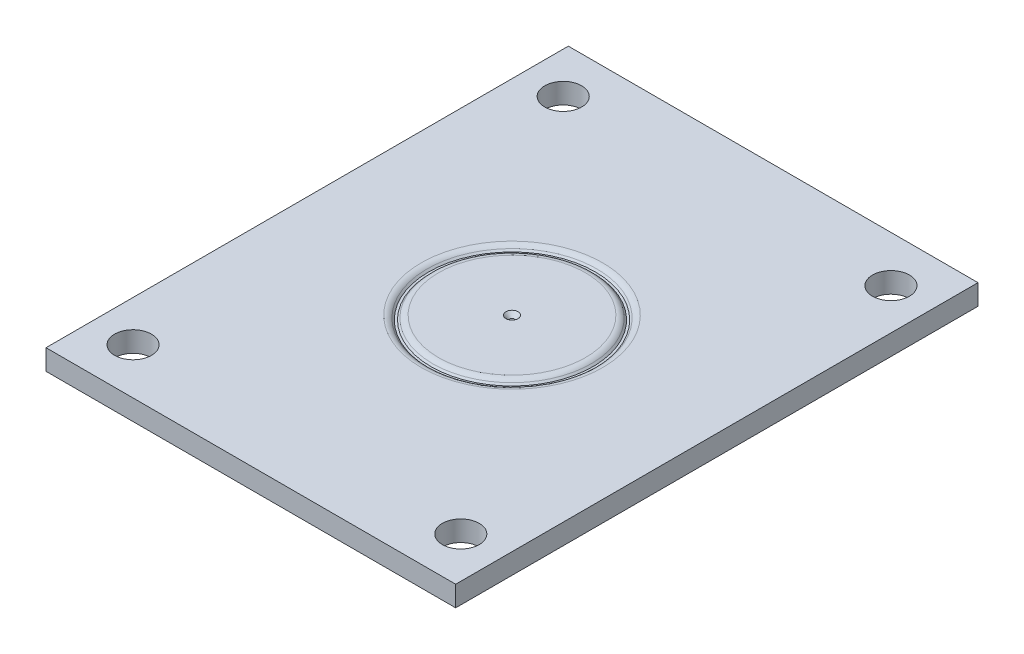
ISO-10303-21;
HEADER;
FILE_DESCRIPTION(('STEP AP214'),'2;1');
FILE_NAME('part.step','',(''),(''),'','','');
FILE_SCHEMA(('AUTOMOTIVE_DESIGN { 1 0 10303 214 1 1 1 1 }'));
ENDSEC;
DATA;
#1=APPLICATION_CONTEXT('core data for automotive mechanical design processes');
#2=APPLICATION_PROTOCOL_DEFINITION('international standard','automotive_design',2000,#1);
#3=PRODUCT_CONTEXT('',#1,'mechanical');
#4=PRODUCT('Part','Part','',(#3));
#5=PRODUCT_RELATED_PRODUCT_CATEGORY('part','',(#4));
#6=PRODUCT_DEFINITION_FORMATION('','',#4);
#7=PRODUCT_DEFINITION_CONTEXT('part definition',#1,'design');
#8=PRODUCT_DEFINITION('design','',#6,#7);
#9=PRODUCT_DEFINITION_SHAPE('','',#8);
#10=(LENGTH_UNIT() NAMED_UNIT(*) SI_UNIT(.MILLI.,.METRE.));
#11=(NAMED_UNIT(*) PLANE_ANGLE_UNIT() SI_UNIT($,.RADIAN.));
#12=(NAMED_UNIT(*) SI_UNIT($,.STERADIAN.) SOLID_ANGLE_UNIT());
#13=UNCERTAINTY_MEASURE_WITH_UNIT(LENGTH_MEASURE(1.E-05),#10,'distance_accuracy_value','');
#14=(GEOMETRIC_REPRESENTATION_CONTEXT(3) GLOBAL_UNCERTAINTY_ASSIGNED_CONTEXT((#13)) GLOBAL_UNIT_ASSIGNED_CONTEXT((#10,
#11,#12)) REPRESENTATION_CONTEXT('',''));
#15=CARTESIAN_POINT('',(0.,0.,0.));
#16=DIRECTION('',(0.,0.,1.));
#17=DIRECTION('',(1.,0.,0.));
#18=AXIS2_PLACEMENT_3D('',#15,#16,#17);
#19=CARTESIAN_POINT('',(-82.636655948553,10.,-47.427652733119));
#20=DIRECTION('',(1.,0.,0.));
#21=DIRECTION('',(0.,0.,-1.));
#22=AXIS2_PLACEMENT_3D('',#19,#20,#21);
#23=PLANE('',#22);
#24=DIRECTION('',(0.,0.,1.));
#25=VECTOR('',#24,1.);
#26=CARTESIAN_POINT('',(-82.636655948553,0.,-47.427652733119));
#27=LINE('',#26,#25);
#28=CARTESIAN_POINT('',(-82.636655948553,0.,-47.427652733119));
#29=VERTEX_POINT('',#28);
#30=CARTESIAN_POINT('',(-82.636655948553,0.,207.572347266881));
#31=VERTEX_POINT('',#30);
#32=EDGE_CURVE('E103',#29,#31,#27,.T.);
#33=ORIENTED_EDGE('',*,*,#32,.T.);
#34=DIRECTION('',(0.,-1.,0.));
#35=VECTOR('',#34,1.);
#36=CARTESIAN_POINT('',(-82.636655948553,10.,207.572347266881));
#37=LINE('',#36,#35);
#38=CARTESIAN_POINT('',(-82.636655948553,10.,207.572347266881));
#39=VERTEX_POINT('',#38);
#40=EDGE_CURVE('E94',#39,#31,#37,.T.);
#41=ORIENTED_EDGE('',*,*,#40,.F.);
#42=DIRECTION('',(0.,0.,1.));
#43=VECTOR('',#42,1.);
#44=CARTESIAN_POINT('',(-82.636655948553,10.,-47.427652733119));
#45=LINE('',#44,#43);
#46=CARTESIAN_POINT('',(-82.636655948553,10.,-47.427652733119));
#47=VERTEX_POINT('',#46);
#48=EDGE_CURVE('E88',#47,#39,#45,.T.);
#49=ORIENTED_EDGE('',*,*,#48,.F.);
#50=DIRECTION('',(0.,-1.,0.));
#51=VECTOR('',#50,1.);
#52=CARTESIAN_POINT('',(-82.636655948553,10.,-47.427652733119));
#53=LINE('',#52,#51);
#54=EDGE_CURVE('E99',#47,#29,#53,.T.);
#55=ORIENTED_EDGE('',*,*,#54,.T.);
#56=EDGE_LOOP('',(#33,#41,#49,#55));
#57=FACE_BOUND('',#56,.T.);
#58=ADVANCED_FACE('F35',(#57),#23,.F.);
#59=CARTESIAN_POINT('',(-82.636655948553,10.,207.572347266881));
#60=DIRECTION('',(0.,0.,-1.));
#61=DIRECTION('',(-1.,0.,0.));
#62=AXIS2_PLACEMENT_3D('',#59,#60,#61);
#63=PLANE('',#62);
#64=DIRECTION('',(1.,0.,0.));
#65=VECTOR('',#64,1.);
#66=CARTESIAN_POINT('',(-82.636655948553,0.,207.572347266881));
#67=LINE('',#66,#65);
#68=CARTESIAN_POINT('',(117.363344051447,0.,207.572347266881));
#69=VERTEX_POINT('',#68);
#70=EDGE_CURVE('E93',#31,#69,#67,.T.);
#71=ORIENTED_EDGE('',*,*,#70,.T.);
#72=DIRECTION('',(0.,-1.,0.));
#73=VECTOR('',#72,1.);
#74=CARTESIAN_POINT('',(117.363344051447,10.,207.572347266881));
#75=LINE('',#74,#73);
#76=CARTESIAN_POINT('',(117.363344051447,10.,207.572347266881));
#77=VERTEX_POINT('',#76);
#78=EDGE_CURVE('E91',#77,#69,#75,.T.);
#79=ORIENTED_EDGE('',*,*,#78,.F.);
#80=DIRECTION('',(1.,0.,0.));
#81=VECTOR('',#80,1.);
#82=CARTESIAN_POINT('',(-82.636655948553,10.,207.572347266881));
#83=LINE('',#82,#81);
#84=EDGE_CURVE('E83',#39,#77,#83,.T.);
#85=ORIENTED_EDGE('',*,*,#84,.F.);
#86=ORIENTED_EDGE('',*,*,#40,.T.);
#87=EDGE_LOOP('',(#71,#79,#85,#86));
#88=FACE_BOUND('',#87,.T.);
#89=ADVANCED_FACE('F92',(#88),#63,.F.);
#90=CARTESIAN_POINT('',(117.363344051447,10.,-47.427652733119));
#91=DIRECTION('',(-1.,0.,0.));
#92=DIRECTION('',(0.,0.,1.));
#93=AXIS2_PLACEMENT_3D('',#90,#91,#92);
#94=PLANE('',#93);
#95=DIRECTION('',(0.,0.,-1.));
#96=VECTOR('',#95,1.);
#97=CARTESIAN_POINT('',(117.363344051447,0.,-47.427652733119));
#98=LINE('',#97,#96);
#99=CARTESIAN_POINT('',(117.363344051447,0.,-47.427652733119));
#100=VERTEX_POINT('',#99);
#101=EDGE_CURVE('E69',#69,#100,#98,.T.);
#102=ORIENTED_EDGE('',*,*,#101,.T.);
#103=DIRECTION('',(0.,-1.,0.));
#104=VECTOR('',#103,1.);
#105=CARTESIAN_POINT('',(117.363344051447,10.,-47.427652733119));
#106=LINE('',#105,#104);
#107=CARTESIAN_POINT('',(117.363344051447,10.,-47.427652733119));
#108=VERTEX_POINT('',#107);
#109=EDGE_CURVE('E95',#108,#100,#106,.T.);
#110=ORIENTED_EDGE('',*,*,#109,.F.);
#111=DIRECTION('',(0.,0.,-1.));
#112=VECTOR('',#111,1.);
#113=CARTESIAN_POINT('',(117.363344051447,10.,-47.427652733119));
#114=LINE('',#113,#112);
#115=EDGE_CURVE('E86',#77,#108,#114,.T.);
#116=ORIENTED_EDGE('',*,*,#115,.F.);
#117=ORIENTED_EDGE('',*,*,#78,.T.);
#118=EDGE_LOOP('',(#102,#110,#116,#117));
#119=FACE_BOUND('',#118,.T.);
#120=ADVANCED_FACE('F97',(#119),#94,.F.);
#121=CARTESIAN_POINT('',(-82.636655948553,10.,-47.427652733119));
#122=DIRECTION('',(0.,0.,1.));
#123=DIRECTION('',(1.,0.,0.));
#124=AXIS2_PLACEMENT_3D('',#121,#122,#123);
#125=PLANE('',#124);
#126=DIRECTION('',(-1.,0.,0.));
#127=VECTOR('',#126,1.);
#128=CARTESIAN_POINT('',(-82.636655948553,0.,-47.427652733119));
#129=LINE('',#128,#127);
#130=EDGE_CURVE('E75',#100,#29,#129,.T.);
#131=ORIENTED_EDGE('',*,*,#130,.T.);
#132=ORIENTED_EDGE('',*,*,#54,.F.);
#133=DIRECTION('',(-1.,0.,0.));
#134=VECTOR('',#133,1.);
#135=CARTESIAN_POINT('',(-82.636655948553,10.,-47.427652733119));
#136=LINE('',#135,#134);
#137=EDGE_CURVE('E52',#108,#47,#136,.T.);
#138=ORIENTED_EDGE('',*,*,#137,.F.);
#139=ORIENTED_EDGE('',*,*,#109,.T.);
#140=EDGE_LOOP('',(#131,#132,#138,#139));
#141=FACE_BOUND('',#140,.T.);
#142=ADVANCED_FACE('F163',(#141),#125,.F.);
#143=CARTESIAN_POINT('',(0.,10.,0.));
#144=DIRECTION('',(0.,1.,0.));
#145=DIRECTION('',(0.,0.,1.));
#146=AXIS2_PLACEMENT_3D('',#143,#144,#145);
#147=PLANE('',#146);
#148=CARTESIAN_POINT('',(17.363344051447,10.,80.072347266881));
#149=DIRECTION('',(0.,1.,0.));
#150=DIRECTION('',(0.,0.,1.));
#151=AXIS2_PLACEMENT_3D('',#148,#149,#150);
#152=CIRCLE('',#151,44.2957123847064);
#153=CARTESIAN_POINT('',(17.363344051447,10.,124.368059651587));
#154=VERTEX_POINT('',#153);
#155=EDGE_CURVE('E133',#154,#154,#152,.F.);
#156=ORIENTED_EDGE('',*,*,#155,.T.);
#157=EDGE_LOOP('',(#156));
#158=FACE_BOUND('',#157,.T.);
#159=CARTESIAN_POINT('',(97.363344051447,10.,-24.927652733119));
#160=DIRECTION('',(0.,1.,0.));
#161=DIRECTION('',(0.,0.,1.));
#162=AXIS2_PLACEMENT_3D('',#159,#160,#161);
#163=CIRCLE('',#162,8.99999999999999);
#164=CARTESIAN_POINT('',(97.363344051447,10.,-15.927652733119));
#165=VERTEX_POINT('',#164);
#166=EDGE_CURVE('E130',#165,#165,#163,.T.);
#167=ORIENTED_EDGE('',*,*,#166,.F.);
#168=EDGE_LOOP('',(#167));
#169=FACE_BOUND('',#168,.T.);
#170=CARTESIAN_POINT('',(-62.636655948553,10.,185.072347266881));
#171=DIRECTION('',(0.,1.,0.));
#172=DIRECTION('',(0.,0.,1.));
#173=AXIS2_PLACEMENT_3D('',#170,#171,#172);
#174=CIRCLE('',#173,8.99999999999999);
#175=CARTESIAN_POINT('',(-62.636655948553,10.,194.072347266881));
#176=VERTEX_POINT('',#175);
#177=EDGE_CURVE('E126',#176,#176,#174,.T.);
#178=ORIENTED_EDGE('',*,*,#177,.F.);
#179=EDGE_LOOP('',(#178));
#180=FACE_BOUND('',#179,.T.);
#181=CARTESIAN_POINT('',(-62.636655948553,10.,-24.927652733119));
#182=DIRECTION('',(0.,1.,0.));
#183=DIRECTION('',(0.,0.,1.));
#184=AXIS2_PLACEMENT_3D('',#181,#182,#183);
#185=CIRCLE('',#184,8.99999999999999);
#186=CARTESIAN_POINT('',(-62.636655948553,10.,-15.927652733119));
#187=VERTEX_POINT('',#186);
#188=EDGE_CURVE('E122',#187,#187,#185,.T.);
#189=ORIENTED_EDGE('',*,*,#188,.F.);
#190=EDGE_LOOP('',(#189));
#191=FACE_BOUND('',#190,.T.);
#192=CARTESIAN_POINT('',(97.363344051447,10.,185.072347266881));
#193=DIRECTION('',(0.,1.,0.));
#194=DIRECTION('',(0.,0.,1.));
#195=AXIS2_PLACEMENT_3D('',#192,#193,#194);
#196=CIRCLE('',#195,8.99999999999999);
#197=CARTESIAN_POINT('',(97.363344051447,10.,194.072347266881));
#198=VERTEX_POINT('',#197);
#199=EDGE_CURVE('E118',#198,#198,#196,.T.);
#200=ORIENTED_EDGE('',*,*,#199,.F.);
#201=EDGE_LOOP('',(#200));
#202=FACE_BOUND('',#201,.T.);
#203=ORIENTED_EDGE('',*,*,#48,.T.);
#204=ORIENTED_EDGE('',*,*,#84,.T.);
#205=ORIENTED_EDGE('',*,*,#115,.T.);
#206=ORIENTED_EDGE('',*,*,#137,.T.);
#207=EDGE_LOOP('',(#203,#204,#205,#206));
#208=FACE_BOUND('',#207,.T.);
#209=ADVANCED_FACE('F84',(#158,#169,#180,#191,#202,#208),#147,.T.);
#210=CARTESIAN_POINT('',(0.,0.,0.));
#211=DIRECTION('',(0.,1.,0.));
#212=DIRECTION('',(0.,0.,1.));
#213=AXIS2_PLACEMENT_3D('',#210,#211,#212);
#214=PLANE('',#213);
#215=CARTESIAN_POINT('',(97.363344051447,0.,-24.927652733119));
#216=DIRECTION('',(0.,1.,0.));
#217=DIRECTION('',(0.,0.,1.));
#218=AXIS2_PLACEMENT_3D('',#215,#216,#217);
#219=CIRCLE('',#218,8.99999999999999);
#220=CARTESIAN_POINT('',(97.363344051447,0.,-15.927652733119));
#221=VERTEX_POINT('',#220);
#222=EDGE_CURVE('E127',#221,#221,#219,.T.);
#223=ORIENTED_EDGE('',*,*,#222,.T.);
#224=EDGE_LOOP('',(#223));
#225=FACE_BOUND('',#224,.T.);
#226=CARTESIAN_POINT('',(-62.636655948553,0.,185.072347266881));
#227=DIRECTION('',(0.,1.,0.));
#228=DIRECTION('',(0.,0.,1.));
#229=AXIS2_PLACEMENT_3D('',#226,#227,#228);
#230=CIRCLE('',#229,8.99999999999999);
#231=CARTESIAN_POINT('',(-62.636655948553,0.,194.072347266881));
#232=VERTEX_POINT('',#231);
#233=EDGE_CURVE('E123',#232,#232,#230,.T.);
#234=ORIENTED_EDGE('',*,*,#233,.T.);
#235=EDGE_LOOP('',(#234));
#236=FACE_BOUND('',#235,.T.);
#237=CARTESIAN_POINT('',(-62.636655948553,0.,-24.927652733119));
#238=DIRECTION('',(0.,1.,0.));
#239=DIRECTION('',(0.,0.,1.));
#240=AXIS2_PLACEMENT_3D('',#237,#238,#239);
#241=CIRCLE('',#240,8.99999999999999);
#242=CARTESIAN_POINT('',(-62.636655948553,0.,-15.927652733119));
#243=VERTEX_POINT('',#242);
#244=EDGE_CURVE('E119',#243,#243,#241,.T.);
#245=ORIENTED_EDGE('',*,*,#244,.T.);
#246=EDGE_LOOP('',(#245));
#247=FACE_BOUND('',#246,.T.);
#248=CARTESIAN_POINT('',(97.363344051447,0.,185.072347266881));
#249=DIRECTION('',(0.,1.,0.));
#250=DIRECTION('',(0.,0.,1.));
#251=AXIS2_PLACEMENT_3D('',#248,#249,#250);
#252=CIRCLE('',#251,8.99999999999999);
#253=CARTESIAN_POINT('',(97.363344051447,0.,194.072347266881));
#254=VERTEX_POINT('',#253);
#255=EDGE_CURVE('E114',#254,#254,#252,.T.);
#256=ORIENTED_EDGE('',*,*,#255,.T.);
#257=EDGE_LOOP('',(#256));
#258=FACE_BOUND('',#257,.T.);
#259=CARTESIAN_POINT('',(17.363344051447,0.,80.072347266881));
#260=DIRECTION('',(0.,-1.,0.));
#261=DIRECTION('',(0.,0.,-1.));
#262=AXIS2_PLACEMENT_3D('',#259,#260,#261);
#263=CIRCLE('',#262,49.5925531337488);
#264=CARTESIAN_POINT('',(17.363344051447,0.,30.4797941331323));
#265=VERTEX_POINT('',#264);
#266=EDGE_CURVE('E117',#265,#265,#263,.T.);
#267=ORIENTED_EDGE('',*,*,#266,.F.);
#268=EDGE_LOOP('',(#267));
#269=FACE_BOUND('',#268,.T.);
#270=ORIENTED_EDGE('',*,*,#32,.F.);
#271=ORIENTED_EDGE('',*,*,#130,.F.);
#272=ORIENTED_EDGE('',*,*,#101,.F.);
#273=ORIENTED_EDGE('',*,*,#70,.F.);
#274=EDGE_LOOP('',(#270,#271,#272,#273));
#275=FACE_BOUND('',#274,.T.);
#276=ADVANCED_FACE('F166',(#225,#236,#247,#258,#269,#275),#214,.F.);
#277=CARTESIAN_POINT('',(17.363344051447,3.,80.072347266881));
#278=DIRECTION('',(0.,-1.,0.));
#279=DIRECTION('',(0.,0.,-1.));
#280=AXIS2_PLACEMENT_3D('',#277,#278,#279);
#281=CYLINDRICAL_SURFACE('',#280,49.5925531337488);
#282=CARTESIAN_POINT('',(17.363344051447,3.,80.072347266881));
#283=DIRECTION('',(0.,-1.,0.));
#284=DIRECTION('',(0.,0.,-1.));
#285=AXIS2_PLACEMENT_3D('',#282,#283,#284);
#286=CIRCLE('',#285,49.5925531337488);
#287=CARTESIAN_POINT('',(17.363344051447,3.,30.4797941331323));
#288=VERTEX_POINT('',#287);
#289=EDGE_CURVE('E106',#288,#288,#286,.T.);
#290=ORIENTED_EDGE('',*,*,#289,.F.);
#291=EDGE_LOOP('',(#290));
#292=FACE_BOUND('',#291,.T.);
#293=ORIENTED_EDGE('',*,*,#266,.T.);
#294=EDGE_LOOP('',(#293));
#295=FACE_BOUND('',#294,.T.);
#296=ADVANCED_FACE('F169',(#292,#295),#281,.F.);
#297=CARTESIAN_POINT('',(17.363344051447,3.,80.072347266881));
#298=DIRECTION('',(0.,-1.,0.));
#299=DIRECTION('',(0.,0.,-1.));
#300=AXIS2_PLACEMENT_3D('',#297,#298,#299);
#301=PLANE('',#300);
#302=ORIENTED_EDGE('',*,*,#289,.T.);
#303=EDGE_LOOP('',(#302));
#304=FACE_BOUND('',#303,.T.);
#305=ADVANCED_FACE('F176',(#304),#301,.T.);
#306=CARTESIAN_POINT('',(97.363344051447,-59.,185.072347266881));
#307=DIRECTION('',(0.,1.,0.));
#308=DIRECTION('',(0.,0.,1.));
#309=AXIS2_PLACEMENT_3D('',#306,#307,#308);
#310=CYLINDRICAL_SURFACE('',#309,8.99999999999999);
#311=ORIENTED_EDGE('',*,*,#199,.T.);
#312=EDGE_LOOP('',(#311));
#313=FACE_BOUND('',#312,.T.);
#314=ORIENTED_EDGE('',*,*,#255,.F.);
#315=EDGE_LOOP('',(#314));
#316=FACE_BOUND('',#315,.T.);
#317=ADVANCED_FACE('F180',(#313,#316),#310,.F.);
#318=CARTESIAN_POINT('',(-62.636655948553,-59.,-24.927652733119));
#319=DIRECTION('',(0.,1.,0.));
#320=DIRECTION('',(0.,0.,1.));
#321=AXIS2_PLACEMENT_3D('',#318,#319,#320);
#322=CYLINDRICAL_SURFACE('',#321,8.99999999999999);
#323=ORIENTED_EDGE('',*,*,#188,.T.);
#324=EDGE_LOOP('',(#323));
#325=FACE_BOUND('',#324,.T.);
#326=ORIENTED_EDGE('',*,*,#244,.F.);
#327=EDGE_LOOP('',(#326));
#328=FACE_BOUND('',#327,.T.);
#329=ADVANCED_FACE('F184',(#325,#328),#322,.F.);
#330=CARTESIAN_POINT('',(-62.636655948553,-59.,185.072347266881));
#331=DIRECTION('',(0.,1.,0.));
#332=DIRECTION('',(0.,0.,1.));
#333=AXIS2_PLACEMENT_3D('',#330,#331,#332);
#334=CYLINDRICAL_SURFACE('',#333,8.99999999999999);
#335=ORIENTED_EDGE('',*,*,#177,.T.);
#336=EDGE_LOOP('',(#335));
#337=FACE_BOUND('',#336,.T.);
#338=ORIENTED_EDGE('',*,*,#233,.F.);
#339=EDGE_LOOP('',(#338));
#340=FACE_BOUND('',#339,.T.);
#341=ADVANCED_FACE('F188',(#337,#340),#334,.F.);
#342=CARTESIAN_POINT('',(97.363344051447,-59.,-24.927652733119));
#343=DIRECTION('',(0.,1.,0.));
#344=DIRECTION('',(0.,0.,1.));
#345=AXIS2_PLACEMENT_3D('',#342,#343,#344);
#346=CYLINDRICAL_SURFACE('',#345,8.99999999999999);
#347=ORIENTED_EDGE('',*,*,#166,.T.);
#348=EDGE_LOOP('',(#347));
#349=FACE_BOUND('',#348,.T.);
#350=ORIENTED_EDGE('',*,*,#222,.F.);
#351=EDGE_LOOP('',(#350));
#352=FACE_BOUND('',#351,.T.);
#353=ADVANCED_FACE('F192',(#349,#352),#346,.F.);
#354=CARTESIAN_POINT('',(17.363344051447,10.,80.072347266881));
#355=DIRECTION('',(0.,1.,0.));
#356=DIRECTION('',(0.,0.,1.));
#357=AXIS2_PLACEMENT_3D('',#354,#355,#356);
#358=CONICAL_SURFACE('',#357,42.638858135214,0.78539816339745);
#359=CARTESIAN_POINT('',(17.363344051447,8.82842712474618,80.072347266881));
#360=DIRECTION('',(0.,1.,0.));
#361=DIRECTION('',(0.,0.,1.));
#362=AXIS2_PLACEMENT_3D('',#359,#360,#361);
#363=CIRCLE('',#362,41.4672852599602);
#364=CARTESIAN_POINT('',(17.363344051447,8.82842712474618,121.539632526841));
#365=VERTEX_POINT('',#364);
#366=EDGE_CURVE('E113',#365,#365,#363,.T.);
#367=ORIENTED_EDGE('',*,*,#366,.T.);
#368=EDGE_LOOP('',(#367));
#369=FACE_BOUND('',#368,.T.);
#370=CARTESIAN_POINT('',(17.363344051447,8.,80.072347266881));
#371=DIRECTION('',(0.,1.,0.));
#372=DIRECTION('',(0.,0.,1.));
#373=AXIS2_PLACEMENT_3D('',#370,#371,#372);
#374=CIRCLE('',#373,40.638858135214);
#375=CARTESIAN_POINT('',(17.363344051447,8.,120.711205402095));
#376=VERTEX_POINT('',#375);
#377=EDGE_CURVE('E220',#376,#376,#374,.T.);
#378=ORIENTED_EDGE('',*,*,#377,.F.);
#379=EDGE_LOOP('',(#378));
#380=FACE_BOUND('',#379,.T.);
#381=ADVANCED_FACE('F196',(#369,#380),#358,.F.);
#382=CARTESIAN_POINT('',(17.363344051447,8.,80.072347266881));
#383=DIRECTION('',(0.,1.,0.));
#384=DIRECTION('',(0.,0.,1.));
#385=AXIS2_PLACEMENT_3D('',#382,#383,#384);
#386=PLANE('',#385);
#387=CARTESIAN_POINT('',(17.363344051447,8.,80.072347266881));
#388=DIRECTION('',(0.,1.,0.));
#389=DIRECTION('',(0.,0.,1.));
#390=AXIS2_PLACEMENT_3D('',#387,#388,#389);
#391=CIRCLE('',#390,39.5406475767411);
#392=CARTESIAN_POINT('',(17.363344051447,8.,119.612994843622));
#393=VERTEX_POINT('',#392);
#394=EDGE_CURVE('E216',#393,#393,#391,.T.);
#395=ORIENTED_EDGE('',*,*,#394,.F.);
#396=EDGE_LOOP('',(#395));
#397=FACE_BOUND('',#396,.T.);
#398=ORIENTED_EDGE('',*,*,#377,.T.);
#399=EDGE_LOOP('',(#398));
#400=FACE_BOUND('',#399,.T.);
#401=ADVANCED_FACE('F200',(#397,#400),#386,.T.);
#402=CARTESIAN_POINT('',(17.363344051447,10.,80.072347266881));
#403=DIRECTION('',(0.,-1.,0.));
#404=DIRECTION('',(0.,0.,1.));
#405=AXIS2_PLACEMENT_3D('',#402,#403,#404);
#406=CONICAL_SURFACE('',#405,37.540647576741,0.78539816339745);
#407=CARTESIAN_POINT('',(17.363344051447,8.82842712474618,80.072347266881));
#408=DIRECTION('',(0.,1.,0.));
#409=DIRECTION('',(0.,0.,1.));
#410=AXIS2_PLACEMENT_3D('',#407,#408,#409);
#411=CIRCLE('',#410,38.7122204519949);
#412=CARTESIAN_POINT('',(17.363344051447,8.82842712474618,118.784567718876));
#413=VERTEX_POINT('',#412);
#414=EDGE_CURVE('E11',#413,#413,#411,.F.);
#415=ORIENTED_EDGE('',*,*,#414,.T.);
#416=EDGE_LOOP('',(#415));
#417=FACE_BOUND('',#416,.T.);
#418=ORIENTED_EDGE('',*,*,#394,.T.);
#419=EDGE_LOOP('',(#418));
#420=FACE_BOUND('',#419,.T.);
#421=ADVANCED_FACE('F202',(#417,#420),#406,.T.);
#422=CARTESIAN_POINT('',(17.363344051447,10.,80.072347266881));
#423=DIRECTION('',(0.,1.,0.));
#424=DIRECTION('',(0.,0.,1.));
#425=AXIS2_PLACEMENT_3D('',#422,#423,#424);
#426=CIRCLE('',#425,2.95231334631637);
#427=CARTESIAN_POINT('',(17.363344051447,10.,83.0246606131974));
#428=VERTEX_POINT('',#427);
#429=EDGE_CURVE('E217',#428,#428,#426,.T.);
#430=ORIENTED_EDGE('',*,*,#429,.F.);
#431=EDGE_LOOP('',(#430));
#432=FACE_BOUND('',#431,.T.);
#433=CARTESIAN_POINT('',(17.363344051447,10.,80.072347266881));
#434=DIRECTION('',(0.,1.,0.));
#435=DIRECTION('',(0.,0.,1.));
#436=AXIS2_PLACEMENT_3D('',#433,#434,#435);
#437=CIRCLE('',#436,35.8837933272487);
#438=CARTESIAN_POINT('',(17.363344051447,10.,115.95614059413));
#439=VERTEX_POINT('',#438);
#440=EDGE_CURVE('E44',#439,#439,#437,.T.);
#441=ORIENTED_EDGE('',*,*,#440,.T.);
#442=EDGE_LOOP('',(#441));
#443=FACE_BOUND('',#442,.T.);
#444=ADVANCED_FACE('F138',(#432,#443),#147,.T.);
#445=CARTESIAN_POINT('',(17.363344051447,6.,80.072347266881));
#446=DIRECTION('',(0.,1.,0.));
#447=DIRECTION('',(0.,0.,1.));
#448=AXIS2_PLACEMENT_3D('',#445,#446,#447);
#449=TOROIDAL_SURFACE('',#448,44.2957123847064,4.);
#450=ORIENTED_EDGE('',*,*,#155,.F.);
#451=EDGE_LOOP('',(#450));
#452=FACE_BOUND('',#451,.T.);
#453=ORIENTED_EDGE('',*,*,#366,.F.);
#454=EDGE_LOOP('',(#453));
#455=FACE_BOUND('',#454,.T.);
#456=ADVANCED_FACE('F142',(#452,#455),#449,.T.);
#457=CARTESIAN_POINT('',(17.363344051447,6.,80.072347266881));
#458=DIRECTION('',(0.,1.,0.));
#459=DIRECTION('',(0.,0.,1.));
#460=AXIS2_PLACEMENT_3D('',#457,#458,#459);
#461=TOROIDAL_SURFACE('',#460,35.8837933272487,4.);
#462=ORIENTED_EDGE('',*,*,#414,.F.);
#463=EDGE_LOOP('',(#462));
#464=FACE_BOUND('',#463,.T.);
#465=ORIENTED_EDGE('',*,*,#440,.F.);
#466=EDGE_LOOP('',(#465));
#467=FACE_BOUND('',#466,.T.);
#468=ADVANCED_FACE('F37',(#464,#467),#461,.T.);
#469=CARTESIAN_POINT('',(17.363344051447,10.,80.072347266881));
#470=DIRECTION('',(0.,1.,0.));
#471=DIRECTION('',(0.,0.,1.));
#472=AXIS2_PLACEMENT_3D('',#469,#470,#471);
#473=CONICAL_SURFACE('',#472,2.95231334631637,0.78539816339745);
#474=CARTESIAN_POINT('',(17.363344051447,8.,80.072347266881));
#475=DIRECTION('',(0.,1.,0.));
#476=DIRECTION('',(0.,0.,1.));
#477=AXIS2_PLACEMENT_3D('',#474,#475,#476);
#478=CIRCLE('',#477,0.95231334631636);
#479=CARTESIAN_POINT('',(17.363344051447,8.,81.0246606131974));
#480=VERTEX_POINT('',#479);
#481=EDGE_CURVE('E215',#480,#480,#478,.T.);
#482=CARTESIAN_POINT('',(17.363344051447,8.,81.0246606131974));
#483=CARTESIAN_POINT('',(17.363344051447,8.02083333333334,81.0454939465307));
#484=CARTESIAN_POINT('',(17.363344051447,8.04166666666667,81.0663272798641));
#485=CARTESIAN_POINT('',(17.363344051447,8.08333333333333,81.1079939465307));
#486=CARTESIAN_POINT('',(17.363344051447,8.10416666666667,81.1288272798641));
#487=CARTESIAN_POINT('',(17.363344051447,8.14583333333333,81.1704939465307));
#488=CARTESIAN_POINT('',(17.363344051447,8.16666666666667,81.1913272798641));
#489=CARTESIAN_POINT('',(17.363344051447,8.20833333333333,81.2329939465307));
#490=CARTESIAN_POINT('',(17.363344051447,8.22916666666666,81.2538272798641));
#491=CARTESIAN_POINT('',(17.363344051447,8.27083333333333,81.2954939465307));
#492=CARTESIAN_POINT('',(17.363344051447,8.29166666666667,81.3163272798641));
#493=CARTESIAN_POINT('',(17.363344051447,8.33333333333333,81.3579939465307));
#494=CARTESIAN_POINT('',(17.363344051447,8.35416666666666,81.3788272798641));
#495=CARTESIAN_POINT('',(17.363344051447,8.39583333333333,81.4204939465307));
#496=CARTESIAN_POINT('',(17.363344051447,8.41666666666667,81.4413272798641));
#497=CARTESIAN_POINT('',(17.363344051447,8.45833333333333,81.4829939465307));
#498=CARTESIAN_POINT('',(17.363344051447,8.47916666666666,81.5038272798641));
#499=CARTESIAN_POINT('',(17.363344051447,8.52083333333333,81.5454939465307));
#500=CARTESIAN_POINT('',(17.363344051447,8.54166666666667,81.5663272798641));
#501=CARTESIAN_POINT('',(17.363344051447,8.58333333333333,81.6079939465307));
#502=CARTESIAN_POINT('',(17.363344051447,8.60416666666666,81.6288272798641));
#503=CARTESIAN_POINT('',(17.363344051447,8.64583333333333,81.6704939465307));
#504=CARTESIAN_POINT('',(17.363344051447,8.66666666666667,81.6913272798641));
#505=CARTESIAN_POINT('',(17.363344051447,8.70833333333333,81.7329939465307));
#506=CARTESIAN_POINT('',(17.363344051447,8.72916666666667,81.7538272798641));
#507=CARTESIAN_POINT('',(17.363344051447,8.77083333333333,81.7954939465307));
#508=CARTESIAN_POINT('',(17.363344051447,8.79166666666666,81.8163272798641));
#509=CARTESIAN_POINT('',(17.363344051447,8.83333333333333,81.8579939465307));
#510=CARTESIAN_POINT('',(17.363344051447,8.85416666666667,81.8788272798641));
#511=CARTESIAN_POINT('',(17.363344051447,8.89583333333333,81.9204939465307));
#512=CARTESIAN_POINT('',(17.363344051447,8.91666666666666,81.9413272798641));
#513=CARTESIAN_POINT('',(17.363344051447,8.95833333333333,81.9829939465307));
#514=CARTESIAN_POINT('',(17.363344051447,8.97916666666667,82.0038272798641));
#515=CARTESIAN_POINT('',(17.363344051447,9.02083333333333,82.0454939465307));
#516=CARTESIAN_POINT('',(17.363344051447,9.04166666666666,82.0663272798641));
#517=CARTESIAN_POINT('',(17.363344051447,9.08333333333333,82.1079939465307));
#518=CARTESIAN_POINT('',(17.363344051447,9.10416666666667,82.1288272798641));
#519=CARTESIAN_POINT('',(17.363344051447,9.14583333333333,82.1704939465307));
#520=CARTESIAN_POINT('',(17.363344051447,9.16666666666666,82.1913272798641));
#521=CARTESIAN_POINT('',(17.363344051447,9.20833333333333,82.2329939465307));
#522=CARTESIAN_POINT('',(17.363344051447,9.22916666666667,82.2538272798641));
#523=CARTESIAN_POINT('',(17.363344051447,9.27083333333333,82.2954939465307));
#524=CARTESIAN_POINT('',(17.363344051447,9.29166666666666,82.3163272798641));
#525=CARTESIAN_POINT('',(17.363344051447,9.33333333333333,82.3579939465307));
#526=CARTESIAN_POINT('',(17.363344051447,9.35416666666667,82.3788272798641));
#527=CARTESIAN_POINT('',(17.363344051447,9.39583333333333,82.4204939465307));
#528=CARTESIAN_POINT('',(17.363344051447,9.41666666666667,82.4413272798641));
#529=CARTESIAN_POINT('',(17.363344051447,9.45833333333333,82.4829939465307));
#530=CARTESIAN_POINT('',(17.363344051447,9.47916666666667,82.5038272798641));
#531=CARTESIAN_POINT('',(17.363344051447,9.52083333333333,82.5454939465307));
#532=CARTESIAN_POINT('',(17.363344051447,9.54166666666667,82.5663272798641));
#533=CARTESIAN_POINT('',(17.363344051447,9.58333333333333,82.6079939465307));
#534=CARTESIAN_POINT('',(17.363344051447,9.60416666666667,82.6288272798641));
#535=CARTESIAN_POINT('',(17.363344051447,9.64583333333333,82.6704939465307));
#536=CARTESIAN_POINT('',(17.363344051447,9.66666666666667,82.6913272798641));
#537=CARTESIAN_POINT('',(17.363344051447,9.70833333333333,82.7329939465307));
#538=CARTESIAN_POINT('',(17.363344051447,9.72916666666667,82.7538272798641));
#539=CARTESIAN_POINT('',(17.363344051447,9.77083333333333,82.7954939465307));
#540=CARTESIAN_POINT('',(17.363344051447,9.79166666666667,82.8163272798641));
#541=CARTESIAN_POINT('',(17.363344051447,9.83333333333333,82.8579939465307));
#542=CARTESIAN_POINT('',(17.363344051447,9.85416666666667,82.8788272798641));
#543=CARTESIAN_POINT('',(17.363344051447,9.89583333333333,82.9204939465307));
#544=CARTESIAN_POINT('',(17.363344051447,9.91666666666667,82.9413272798641));
#545=CARTESIAN_POINT('',(17.363344051447,9.95833333333333,82.9829939465307));
#546=CARTESIAN_POINT('',(17.363344051447,9.97916666666666,83.0038272798641));
#547=CARTESIAN_POINT('',(17.363344051447,10.,83.0246606131974));
#548=B_SPLINE_CURVE_WITH_KNOTS('',3,(#482,#483,#484,#485,#486,#487,#488,#489,#490,#491,#492,
#493,#494,#495,#496,#497,#498,#499,#500,#501,#502,#503,#504,#505,#506,#507,#508,#509,#510,#511,
#512,#513,#514,#515,#516,#517,#518,#519,#520,#521,#522,#523,#524,#525,#526,#527,#528,#529,#530,
#531,#532,#533,#534,#535,#536,#537,#538,#539,#540,#541,#542,#543,#544,#545,#546,#547),
.UNSPECIFIED.,.F.,.F.,(4,2,2,2,2,2,2,2,2,2,2,2,2,2,2,2,2,2,2,2,2,2,2,2,2,2,2,2,2,2,2,2,4),(0.,
0.0883883476483136,0.176776695296637,0.265165042944949,0.353553390593273,0.441941738241586,
0.53033008588991,0.618718433538223,0.707106781186547,0.79549512883486,0.883883476483184,
0.972271824131497,1.06066017177982,1.14904851942814,1.23743686707646,1.32582521472478,
1.41421356237309,1.50260191002142,1.59099025766973,1.67937860531805,1.76776695296637,
1.85615530061469,1.94454364826301,2.03293199591133,2.12132034355964,2.20970869120797,
2.29809703885628,2.3864853865046,2.47487373415292,2.56326208180124,2.65165042944955,
2.74003877709788,2.82842712474619),.UNSPECIFIED.);
#549=EDGE_CURVE('BSEAM141',#480,#428,#548,.T.);
#550=ORIENTED_EDGE('',*,*,#481,.F.);
#551=ORIENTED_EDGE('',*,*,#429,.T.);
#552=ORIENTED_EDGE('',*,*,#549,.T.);
#553=ORIENTED_EDGE('',*,*,#549,.F.);
#554=EDGE_LOOP('',(#550,#552,#551,#553));
#555=FACE_BOUND('',#554,.T.);
#556=ADVANCED_FACE('F141',(#555),#473,.F.);
#557=CARTESIAN_POINT('',(17.363344051447,8.,80.072347266881));
#558=DIRECTION('',(0.,1.,0.));
#559=DIRECTION('',(0.,0.,1.));
#560=AXIS2_PLACEMENT_3D('',#557,#558,#559);
#561=PLANE('',#560);
#562=ORIENTED_EDGE('',*,*,#481,.T.);
#563=EDGE_LOOP('',(#562));
#564=FACE_BOUND('',#563,.T.);
#565=ADVANCED_FACE('F148',(#564),#561,.T.);
#566=CLOSED_SHELL('',(#58,#89,#120,#142,#209,#276,#296,#305,#317,#329,#341,#353,#381,#401,#421,
#444,#456,#468,#556,#565));
#567=MANIFOLD_SOLID_BREP('B2',#566);
#568=ADVANCED_BREP_SHAPE_REPRESENTATION('',(#18,#567),#14);
#569=SHAPE_DEFINITION_REPRESENTATION(#9,#568);
ENDSEC;
END-ISO-10303-21;
